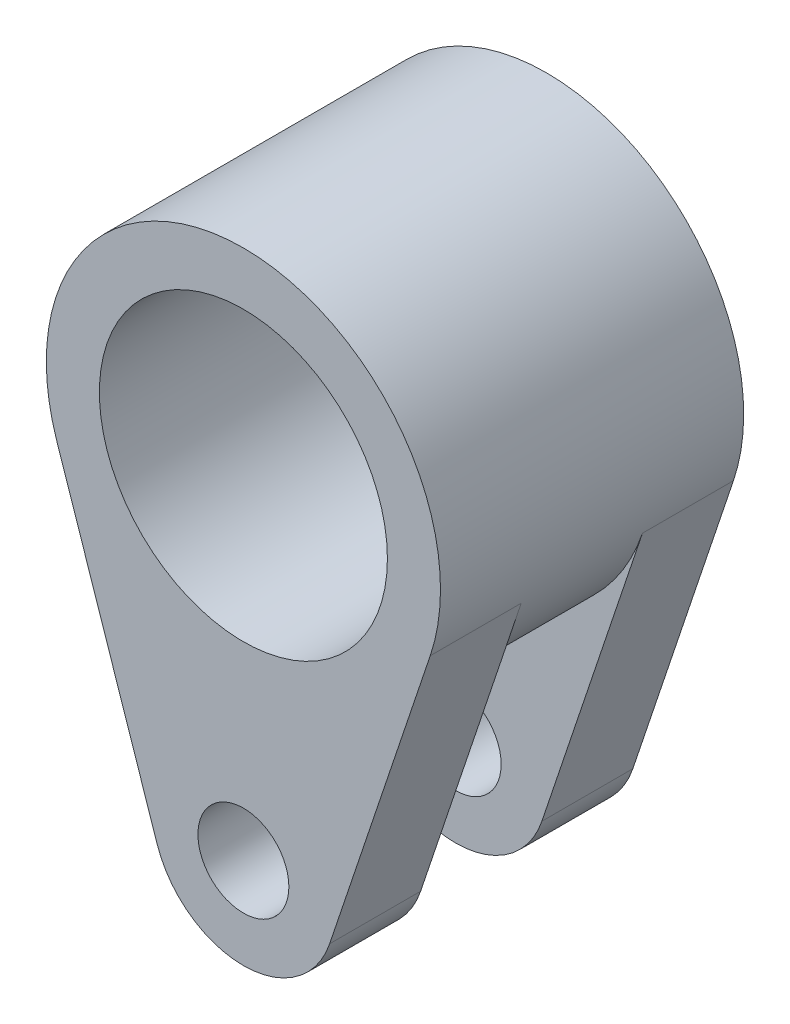
ISO-10303-21;
HEADER;
FILE_DESCRIPTION(('STEP AP214'),'2;1');
FILE_NAME('part.step','',(''),(''),'','','');
FILE_SCHEMA(('AUTOMOTIVE_DESIGN { 1 0 10303 214 1 1 1 1 }'));
ENDSEC;
DATA;
#1=APPLICATION_CONTEXT('core data for automotive mechanical design processes');
#2=APPLICATION_PROTOCOL_DEFINITION('international standard','automotive_design',2000,#1);
#3=PRODUCT_CONTEXT('',#1,'mechanical');
#4=PRODUCT('Part','Part','',(#3));
#5=PRODUCT_RELATED_PRODUCT_CATEGORY('part','',(#4));
#6=PRODUCT_DEFINITION_FORMATION('','',#4);
#7=PRODUCT_DEFINITION_CONTEXT('part definition',#1,'design');
#8=PRODUCT_DEFINITION('design','',#6,#7);
#9=PRODUCT_DEFINITION_SHAPE('','',#8);
#10=(LENGTH_UNIT() NAMED_UNIT(*) SI_UNIT(.MILLI.,.METRE.));
#11=(NAMED_UNIT(*) PLANE_ANGLE_UNIT() SI_UNIT($,.RADIAN.));
#12=(NAMED_UNIT(*) SI_UNIT($,.STERADIAN.) SOLID_ANGLE_UNIT());
#13=UNCERTAINTY_MEASURE_WITH_UNIT(LENGTH_MEASURE(1.E-05),#10,'distance_accuracy_value','');
#14=(GEOMETRIC_REPRESENTATION_CONTEXT(3) GLOBAL_UNCERTAINTY_ASSIGNED_CONTEXT((#13)) GLOBAL_UNIT_ASSIGNED_CONTEXT((#10,
#11,#12)) REPRESENTATION_CONTEXT('',''));
#15=CARTESIAN_POINT('',(0.,0.,0.));
#16=DIRECTION('',(0.,0.,1.));
#17=DIRECTION('',(1.,0.,0.));
#18=AXIS2_PLACEMENT_3D('',#15,#16,#17);
#19=CARTESIAN_POINT('',(0.,0.,10.));
#20=DIRECTION('',(0.,0.,-1.));
#21=DIRECTION('',(-1.,0.,0.));
#22=AXIS2_PLACEMENT_3D('',#19,#20,#21);
#23=CYLINDRICAL_SURFACE('',#22,13.);
#24=CARTESIAN_POINT('',(0.,0.,10.));
#25=DIRECTION('',(0.,0.,1.));
#26=DIRECTION('',(1.,0.,0.));
#27=AXIS2_PLACEMENT_3D('',#24,#25,#26);
#28=CIRCLE('',#27,13.);
#29=CARTESIAN_POINT('',(12.3243862268175,-4.13636363636364,10.));
#30=VERTEX_POINT('',#29);
#31=CARTESIAN_POINT('',(-12.3243862268175,-4.13636363636364,10.));
#32=VERTEX_POINT('',#31);
#33=EDGE_CURVE('E165',#30,#32,#28,.T.);
#34=ORIENTED_EDGE('',*,*,#33,.F.);
#35=DIRECTION('',(0.,0.,1.));
#36=VECTOR('',#35,1.);
#37=CARTESIAN_POINT('',(12.3243862268175,-4.13636363636364,4.));
#38=LINE('',#37,#36);
#39=CARTESIAN_POINT('',(12.3243862268175,-4.13636363636364,4.));
#40=VERTEX_POINT('',#39);
#41=EDGE_CURVE('E157',#40,#30,#38,.T.);
#42=ORIENTED_EDGE('',*,*,#41,.F.);
#43=CARTESIAN_POINT('',(0.,0.,4.));
#44=DIRECTION('',(0.,0.,1.));
#45=DIRECTION('',(1.,0.,0.));
#46=AXIS2_PLACEMENT_3D('',#43,#44,#45);
#47=CIRCLE('',#46,13.);
#48=CARTESIAN_POINT('',(-12.3243862268175,-4.13636363636364,4.));
#49=VERTEX_POINT('',#48);
#50=EDGE_CURVE('E46',#49,#40,#47,.T.);
#51=ORIENTED_EDGE('',*,*,#50,.F.);
#52=DIRECTION('',(0.,0.,1.));
#53=VECTOR('',#52,1.);
#54=CARTESIAN_POINT('',(-12.3243862268175,-4.13636363636364,4.));
#55=LINE('',#54,#53);
#56=EDGE_CURVE('E151',#49,#32,#55,.T.);
#57=ORIENTED_EDGE('',*,*,#56,.T.);
#58=EDGE_LOOP('',(#34,#42,#51,#57));
#59=FACE_BOUND('',#58,.T.);
#60=CARTESIAN_POINT('',(0.,0.,-4.));
#61=DIRECTION('',(0.,0.,-1.));
#62=DIRECTION('',(-1.,0.,0.));
#63=AXIS2_PLACEMENT_3D('',#60,#61,#62);
#64=CIRCLE('',#63,13.);
#65=CARTESIAN_POINT('',(12.3243862268175,-4.13636363636364,-4.));
#66=VERTEX_POINT('',#65);
#67=CARTESIAN_POINT('',(-12.3243862268175,-4.13636363636364,-4.));
#68=VERTEX_POINT('',#67);
#69=EDGE_CURVE('E11',#66,#68,#64,.T.);
#70=ORIENTED_EDGE('',*,*,#69,.F.);
#71=DIRECTION('',(0.,0.,-1.));
#72=VECTOR('',#71,1.);
#73=CARTESIAN_POINT('',(12.3243862268175,-4.13636363636364,-4.));
#74=LINE('',#73,#72);
#75=CARTESIAN_POINT('',(12.3243862268175,-4.13636363636364,-10.));
#76=VERTEX_POINT('',#75);
#77=EDGE_CURVE('E114',#66,#76,#74,.T.);
#78=ORIENTED_EDGE('',*,*,#77,.T.);
#79=CARTESIAN_POINT('',(0.,0.,-10.));
#80=DIRECTION('',(0.,0.,1.));
#81=DIRECTION('',(1.,0.,0.));
#82=AXIS2_PLACEMENT_3D('',#79,#80,#81);
#83=CIRCLE('',#82,13.);
#84=CARTESIAN_POINT('',(-12.3243862268175,-4.13636363636364,-10.));
#85=VERTEX_POINT('',#84);
#86=EDGE_CURVE('E125',#76,#85,#83,.T.);
#87=ORIENTED_EDGE('',*,*,#86,.T.);
#88=DIRECTION('',(0.,0.,-1.));
#89=VECTOR('',#88,1.);
#90=CARTESIAN_POINT('',(-12.3243862268175,-4.13636363636364,-4.));
#91=LINE('',#90,#89);
#92=EDGE_CURVE('E124',#68,#85,#91,.T.);
#93=ORIENTED_EDGE('',*,*,#92,.F.);
#94=EDGE_LOOP('',(#70,#78,#87,#93));
#95=FACE_BOUND('',#94,.T.);
#96=ADVANCED_FACE('F39',(#59,#95),#23,.T.);
#97=CARTESIAN_POINT('',(0.,0.,10.));
#98=DIRECTION('',(0.,0.,1.));
#99=DIRECTION('',(1.,0.,0.));
#100=AXIS2_PLACEMENT_3D('',#97,#98,#99);
#101=PLANE('',#100);
#102=CARTESIAN_POINT('',(0.,0.,10.));
#103=DIRECTION('',(0.,0.,1.));
#104=DIRECTION('',(1.,0.,0.));
#105=AXIS2_PLACEMENT_3D('',#102,#103,#104);
#106=CIRCLE('',#105,9.5);
#107=CARTESIAN_POINT('',(9.5,0.,10.));
#108=VERTEX_POINT('',#107);
#109=EDGE_CURVE('E210',#108,#108,#106,.T.);
#110=ORIENTED_EDGE('',*,*,#109,.F.);
#111=EDGE_LOOP('',(#110));
#112=FACE_BOUND('',#111,.T.);
#113=ORIENTED_EDGE('',*,*,#33,.T.);
#114=DIRECTION('',(0.318181818181818,-0.948029709755191,0.));
#115=VECTOR('',#114,1.);
#116=CARTESIAN_POINT('',(-12.3243862268175,-4.13636363636364,10.));
#117=LINE('',#116,#115);
#118=CARTESIAN_POINT('',(-5.68817825853115,-23.9090909090909,10.));
#119=VERTEX_POINT('',#118);
#120=EDGE_CURVE('E140',#32,#119,#117,.T.);
#121=ORIENTED_EDGE('',*,*,#120,.T.);
#122=CARTESIAN_POINT('',(0.,-22.,10.));
#123=DIRECTION('',(0.,0.,1.));
#124=DIRECTION('',(1.,0.,0.));
#125=AXIS2_PLACEMENT_3D('',#122,#123,#124);
#126=CIRCLE('',#125,6.);
#127=CARTESIAN_POINT('',(5.68817825853115,-23.9090909090909,10.));
#128=VERTEX_POINT('',#127);
#129=EDGE_CURVE('E154',#119,#128,#126,.T.);
#130=ORIENTED_EDGE('',*,*,#129,.T.);
#131=DIRECTION('',(0.318181818181818,0.948029709755191,0.));
#132=VECTOR('',#131,1.);
#133=CARTESIAN_POINT('',(12.3243862268175,-4.13636363636364,10.));
#134=LINE('',#133,#132);
#135=EDGE_CURVE('E61',#128,#30,#134,.T.);
#136=ORIENTED_EDGE('',*,*,#135,.T.);
#137=EDGE_LOOP('',(#113,#121,#130,#136));
#138=FACE_BOUND('',#137,.T.);
#139=CARTESIAN_POINT('',(0.,-22.,10.));
#140=DIRECTION('',(0.,0.,1.));
#141=DIRECTION('',(1.,0.,0.));
#142=AXIS2_PLACEMENT_3D('',#139,#140,#141);
#143=CIRCLE('',#142,3.);
#144=CARTESIAN_POINT('',(3.,-22.,10.));
#145=VERTEX_POINT('',#144);
#146=EDGE_CURVE('E127',#145,#145,#143,.T.);
#147=ORIENTED_EDGE('',*,*,#146,.F.);
#148=EDGE_LOOP('',(#147));
#149=FACE_BOUND('',#148,.T.);
#150=ADVANCED_FACE('F178',(#112,#138,#149),#101,.T.);
#151=CARTESIAN_POINT('',(0.,0.,-10.));
#152=DIRECTION('',(0.,0.,1.));
#153=DIRECTION('',(1.,0.,0.));
#154=AXIS2_PLACEMENT_3D('',#151,#152,#153);
#155=PLANE('',#154);
#156=CARTESIAN_POINT('',(0.,0.,-10.));
#157=DIRECTION('',(0.,0.,1.));
#158=DIRECTION('',(1.,0.,0.));
#159=AXIS2_PLACEMENT_3D('',#156,#157,#158);
#160=CIRCLE('',#159,9.5);
#161=CARTESIAN_POINT('',(9.5,0.,-10.));
#162=VERTEX_POINT('',#161);
#163=EDGE_CURVE('E213',#162,#162,#160,.T.);
#164=ORIENTED_EDGE('',*,*,#163,.T.);
#165=EDGE_LOOP('',(#164));
#166=FACE_BOUND('',#165,.T.);
#167=ORIENTED_EDGE('',*,*,#86,.F.);
#168=DIRECTION('',(0.318181818181818,0.948029709755191,0.));
#169=VECTOR('',#168,1.);
#170=CARTESIAN_POINT('',(12.3243862268175,-4.13636363636364,-10.));
#171=LINE('',#170,#169);
#172=CARTESIAN_POINT('',(5.68817825853115,-23.9090909090909,-10.));
#173=VERTEX_POINT('',#172);
#174=EDGE_CURVE('E53',#173,#76,#171,.T.);
#175=ORIENTED_EDGE('',*,*,#174,.F.);
#176=CARTESIAN_POINT('',(0.,-22.,-10.));
#177=DIRECTION('',(0.,0.,1.));
#178=DIRECTION('',(1.,0.,0.));
#179=AXIS2_PLACEMENT_3D('',#176,#177,#178);
#180=CIRCLE('',#179,6.);
#181=CARTESIAN_POINT('',(-5.68817825853115,-23.9090909090909,-10.));
#182=VERTEX_POINT('',#181);
#183=EDGE_CURVE('E225',#182,#173,#180,.T.);
#184=ORIENTED_EDGE('',*,*,#183,.F.);
#185=DIRECTION('',(0.318181818181818,-0.948029709755191,0.));
#186=VECTOR('',#185,1.);
#187=CARTESIAN_POINT('',(-12.3243862268175,-4.13636363636364,-10.));
#188=LINE('',#187,#186);
#189=EDGE_CURVE('E112',#85,#182,#188,.T.);
#190=ORIENTED_EDGE('',*,*,#189,.F.);
#191=EDGE_LOOP('',(#167,#175,#184,#190));
#192=FACE_BOUND('',#191,.T.);
#193=CARTESIAN_POINT('',(0.,-22.,-10.));
#194=DIRECTION('',(0.,0.,1.));
#195=DIRECTION('',(1.,0.,0.));
#196=AXIS2_PLACEMENT_3D('',#193,#194,#195);
#197=CIRCLE('',#196,3.);
#198=CARTESIAN_POINT('',(3.,-22.,-10.));
#199=VERTEX_POINT('',#198);
#200=EDGE_CURVE('E212',#199,#199,#197,.T.);
#201=ORIENTED_EDGE('',*,*,#200,.T.);
#202=EDGE_LOOP('',(#201));
#203=FACE_BOUND('',#202,.T.);
#204=ADVANCED_FACE('F200',(#166,#192,#203),#155,.F.);
#205=CARTESIAN_POINT('',(0.,0.,4.));
#206=DIRECTION('',(0.,0.,1.));
#207=DIRECTION('',(1.,0.,0.));
#208=AXIS2_PLACEMENT_3D('',#205,#206,#207);
#209=PLANE('',#208);
#210=CARTESIAN_POINT('',(0.,-22.,4.));
#211=DIRECTION('',(0.,0.,1.));
#212=DIRECTION('',(1.,0.,0.));
#213=AXIS2_PLACEMENT_3D('',#210,#211,#212);
#214=CIRCLE('',#213,3.);
#215=CARTESIAN_POINT('',(3.,-22.,4.));
#216=VERTEX_POINT('',#215);
#217=EDGE_CURVE('E131',#216,#216,#214,.T.);
#218=ORIENTED_EDGE('',*,*,#217,.T.);
#219=EDGE_LOOP('',(#218));
#220=FACE_BOUND('',#219,.T.);
#221=DIRECTION('',(0.318181818181818,-0.948029709755191,0.));
#222=VECTOR('',#221,1.);
#223=CARTESIAN_POINT('',(-12.3243862268175,-4.13636363636364,4.));
#224=LINE('',#223,#222);
#225=CARTESIAN_POINT('',(-5.68817825853115,-23.9090909090909,4.));
#226=VERTEX_POINT('',#225);
#227=EDGE_CURVE('E142',#49,#226,#224,.T.);
#228=ORIENTED_EDGE('',*,*,#227,.F.);
#229=ORIENTED_EDGE('',*,*,#50,.T.);
#230=DIRECTION('',(0.318181818181818,0.948029709755191,0.));
#231=VECTOR('',#230,1.);
#232=CARTESIAN_POINT('',(12.3243862268175,-4.13636363636364,4.));
#233=LINE('',#232,#231);
#234=CARTESIAN_POINT('',(5.68817825853115,-23.9090909090909,4.));
#235=VERTEX_POINT('',#234);
#236=EDGE_CURVE('E148',#235,#40,#233,.T.);
#237=ORIENTED_EDGE('',*,*,#236,.F.);
#238=CARTESIAN_POINT('',(0.,-22.,4.));
#239=DIRECTION('',(0.,0.,1.));
#240=DIRECTION('',(1.,0.,0.));
#241=AXIS2_PLACEMENT_3D('',#238,#239,#240);
#242=CIRCLE('',#241,6.);
#243=EDGE_CURVE('E145',#226,#235,#242,.T.);
#244=ORIENTED_EDGE('',*,*,#243,.F.);
#245=EDGE_LOOP('',(#228,#229,#237,#244));
#246=FACE_BOUND('',#245,.T.);
#247=ADVANCED_FACE('F171',(#220,#246),#209,.F.);
#248=CARTESIAN_POINT('',(12.3243862268175,-4.13636363636364,4.));
#249=DIRECTION('',(0.948029709755191,-0.318181818181818,0.));
#250=DIRECTION('',(0.318181818181818,0.948029709755192,0.));
#251=AXIS2_PLACEMENT_3D('',#248,#249,#250);
#252=PLANE('',#251);
#253=ORIENTED_EDGE('',*,*,#135,.F.);
#254=DIRECTION('',(0.,0.,1.));
#255=VECTOR('',#254,1.);
#256=CARTESIAN_POINT('',(5.68817825853115,-23.9090909090909,4.));
#257=LINE('',#256,#255);
#258=EDGE_CURVE('E159',#235,#128,#257,.T.);
#259=ORIENTED_EDGE('',*,*,#258,.F.);
#260=ORIENTED_EDGE('',*,*,#236,.T.);
#261=ORIENTED_EDGE('',*,*,#41,.T.);
#262=EDGE_LOOP('',(#253,#259,#260,#261));
#263=FACE_BOUND('',#262,.T.);
#264=ADVANCED_FACE('F176',(#263),#252,.T.);
#265=CARTESIAN_POINT('',(0.,-22.,4.));
#266=DIRECTION('',(0.,0.,1.));
#267=DIRECTION('',(1.,0.,0.));
#268=AXIS2_PLACEMENT_3D('',#265,#266,#267);
#269=CYLINDRICAL_SURFACE('',#268,6.);
#270=ORIENTED_EDGE('',*,*,#129,.F.);
#271=DIRECTION('',(0.,0.,1.));
#272=VECTOR('',#271,1.);
#273=CARTESIAN_POINT('',(-5.68817825853115,-23.9090909090909,4.));
#274=LINE('',#273,#272);
#275=EDGE_CURVE('E161',#226,#119,#274,.T.);
#276=ORIENTED_EDGE('',*,*,#275,.F.);
#277=ORIENTED_EDGE('',*,*,#243,.T.);
#278=ORIENTED_EDGE('',*,*,#258,.T.);
#279=EDGE_LOOP('',(#270,#276,#277,#278));
#280=FACE_BOUND('',#279,.T.);
#281=ADVANCED_FACE('F184',(#280),#269,.T.);
#282=CARTESIAN_POINT('',(-12.3243862268175,-4.13636363636364,4.));
#283=DIRECTION('',(-0.948029709755191,-0.318181818181818,0.));
#284=DIRECTION('',(0.318181818181818,-0.948029709755192,0.));
#285=AXIS2_PLACEMENT_3D('',#282,#283,#284);
#286=PLANE('',#285);
#287=ORIENTED_EDGE('',*,*,#120,.F.);
#288=ORIENTED_EDGE('',*,*,#56,.F.);
#289=ORIENTED_EDGE('',*,*,#227,.T.);
#290=ORIENTED_EDGE('',*,*,#275,.T.);
#291=EDGE_LOOP('',(#287,#288,#289,#290));
#292=FACE_BOUND('',#291,.T.);
#293=ADVANCED_FACE('F182',(#292),#286,.T.);
#294=CARTESIAN_POINT('',(0.,-22.,4.));
#295=DIRECTION('',(0.,0.,1.));
#296=DIRECTION('',(1.,0.,0.));
#297=AXIS2_PLACEMENT_3D('',#294,#295,#296);
#298=CYLINDRICAL_SURFACE('',#297,3.);
#299=ORIENTED_EDGE('',*,*,#217,.F.);
#300=EDGE_LOOP('',(#299));
#301=FACE_BOUND('',#300,.T.);
#302=ORIENTED_EDGE('',*,*,#146,.T.);
#303=EDGE_LOOP('',(#302));
#304=FACE_BOUND('',#303,.T.);
#305=ADVANCED_FACE('F191',(#301,#304),#298,.F.);
#306=CARTESIAN_POINT('',(0.,0.,-4.));
#307=DIRECTION('',(0.,0.,-1.));
#308=DIRECTION('',(1.,0.,0.));
#309=AXIS2_PLACEMENT_3D('',#306,#307,#308);
#310=PLANE('',#309);
#311=CARTESIAN_POINT('',(0.,-22.,-4.));
#312=DIRECTION('',(0.,0.,1.));
#313=DIRECTION('',(1.,0.,0.));
#314=AXIS2_PLACEMENT_3D('',#311,#312,#313);
#315=CIRCLE('',#314,3.);
#316=CARTESIAN_POINT('',(3.,-22.,-4.));
#317=VERTEX_POINT('',#316);
#318=EDGE_CURVE('E216',#317,#317,#315,.T.);
#319=ORIENTED_EDGE('',*,*,#318,.F.);
#320=EDGE_LOOP('',(#319));
#321=FACE_BOUND('',#320,.T.);
#322=DIRECTION('',(0.318181818181818,0.948029709755191,0.));
#323=VECTOR('',#322,1.);
#324=CARTESIAN_POINT('',(12.3243862268175,-4.13636363636364,-4.));
#325=LINE('',#324,#323);
#326=CARTESIAN_POINT('',(5.68817825853115,-23.9090909090909,-4.));
#327=VERTEX_POINT('',#326);
#328=EDGE_CURVE('E105',#327,#66,#325,.T.);
#329=ORIENTED_EDGE('',*,*,#328,.T.);
#330=ORIENTED_EDGE('',*,*,#69,.T.);
#331=DIRECTION('',(0.318181818181818,-0.948029709755191,0.));
#332=VECTOR('',#331,1.);
#333=CARTESIAN_POINT('',(-12.3243862268175,-4.13636363636364,-4.));
#334=LINE('',#333,#332);
#335=CARTESIAN_POINT('',(-5.68817825853115,-23.9090909090909,-4.));
#336=VERTEX_POINT('',#335);
#337=EDGE_CURVE('E120',#68,#336,#334,.T.);
#338=ORIENTED_EDGE('',*,*,#337,.T.);
#339=CARTESIAN_POINT('',(0.,-22.,-4.));
#340=DIRECTION('',(0.,0.,1.));
#341=DIRECTION('',(1.,0.,0.));
#342=AXIS2_PLACEMENT_3D('',#339,#340,#341);
#343=CIRCLE('',#342,6.);
#344=EDGE_CURVE('E110',#336,#327,#343,.T.);
#345=ORIENTED_EDGE('',*,*,#344,.T.);
#346=EDGE_LOOP('',(#329,#330,#338,#345));
#347=FACE_BOUND('',#346,.T.);
#348=ADVANCED_FACE('F106',(#321,#347),#310,.F.);
#349=CARTESIAN_POINT('',(-12.3243862268175,-4.13636363636364,-4.));
#350=DIRECTION('',(0.948029709755191,0.318181818181818,0.));
#351=DIRECTION('',(-0.318181818181818,0.948029709755192,0.));
#352=AXIS2_PLACEMENT_3D('',#349,#350,#351);
#353=PLANE('',#352);
#354=ORIENTED_EDGE('',*,*,#189,.T.);
#355=DIRECTION('',(0.,0.,-1.));
#356=VECTOR('',#355,1.);
#357=CARTESIAN_POINT('',(-5.68817825853115,-23.9090909090909,-4.));
#358=LINE('',#357,#356);
#359=EDGE_CURVE('E128',#336,#182,#358,.T.);
#360=ORIENTED_EDGE('',*,*,#359,.F.);
#361=ORIENTED_EDGE('',*,*,#337,.F.);
#362=ORIENTED_EDGE('',*,*,#92,.T.);
#363=EDGE_LOOP('',(#354,#360,#361,#362));
#364=FACE_BOUND('',#363,.T.);
#365=ADVANCED_FACE('F229',(#364),#353,.F.);
#366=CARTESIAN_POINT('',(0.,-22.,-4.));
#367=DIRECTION('',(0.,0.,-1.));
#368=DIRECTION('',(-1.,0.,0.));
#369=AXIS2_PLACEMENT_3D('',#366,#367,#368);
#370=CYLINDRICAL_SURFACE('',#369,6.);
#371=ORIENTED_EDGE('',*,*,#183,.T.);
#372=DIRECTION('',(0.,0.,-1.));
#373=VECTOR('',#372,1.);
#374=CARTESIAN_POINT('',(5.68817825853115,-23.9090909090909,-4.));
#375=LINE('',#374,#373);
#376=EDGE_CURVE('E119',#327,#173,#375,.T.);
#377=ORIENTED_EDGE('',*,*,#376,.F.);
#378=ORIENTED_EDGE('',*,*,#344,.F.);
#379=ORIENTED_EDGE('',*,*,#359,.T.);
#380=EDGE_LOOP('',(#371,#377,#378,#379));
#381=FACE_BOUND('',#380,.T.);
#382=ADVANCED_FACE('F231',(#381),#370,.T.);
#383=CARTESIAN_POINT('',(12.3243862268175,-4.13636363636364,-4.));
#384=DIRECTION('',(-0.948029709755191,0.318181818181818,0.));
#385=DIRECTION('',(-0.318181818181818,-0.948029709755192,0.));
#386=AXIS2_PLACEMENT_3D('',#383,#384,#385);
#387=PLANE('',#386);
#388=ORIENTED_EDGE('',*,*,#174,.T.);
#389=ORIENTED_EDGE('',*,*,#77,.F.);
#390=ORIENTED_EDGE('',*,*,#328,.F.);
#391=ORIENTED_EDGE('',*,*,#376,.T.);
#392=EDGE_LOOP('',(#388,#389,#390,#391));
#393=FACE_BOUND('',#392,.T.);
#394=ADVANCED_FACE('F115',(#393),#387,.F.);
#395=CARTESIAN_POINT('',(0.,-22.,-4.));
#396=DIRECTION('',(0.,0.,-1.));
#397=DIRECTION('',(-1.,0.,0.));
#398=AXIS2_PLACEMENT_3D('',#395,#396,#397);
#399=CYLINDRICAL_SURFACE('',#398,3.);
#400=ORIENTED_EDGE('',*,*,#318,.T.);
#401=EDGE_LOOP('',(#400));
#402=FACE_BOUND('',#401,.T.);
#403=ORIENTED_EDGE('',*,*,#200,.F.);
#404=EDGE_LOOP('',(#403));
#405=FACE_BOUND('',#404,.T.);
#406=ADVANCED_FACE('F235',(#402,#405),#399,.F.);
#407=CARTESIAN_POINT('',(0.,0.,-10.));
#408=DIRECTION('',(0.,0.,1.));
#409=DIRECTION('',(1.,0.,0.));
#410=AXIS2_PLACEMENT_3D('',#407,#408,#409);
#411=CYLINDRICAL_SURFACE('',#410,9.5);
#412=ORIENTED_EDGE('',*,*,#109,.T.);
#413=EDGE_LOOP('',(#412));
#414=FACE_BOUND('',#413,.T.);
#415=ORIENTED_EDGE('',*,*,#163,.F.);
#416=EDGE_LOOP('',(#415));
#417=FACE_BOUND('',#416,.T.);
#418=ADVANCED_FACE('F236',(#414,#417),#411,.F.);
#419=CLOSED_SHELL('',(#96,#150,#204,#247,#264,#281,#293,#305,#348,#365,#382,#394,#406,#418));
#420=MANIFOLD_SOLID_BREP('B2',#419);
#421=ADVANCED_BREP_SHAPE_REPRESENTATION('',(#18,#420),#14);
#422=SHAPE_DEFINITION_REPRESENTATION(#9,#421);
ENDSEC;
END-ISO-10303-21;
